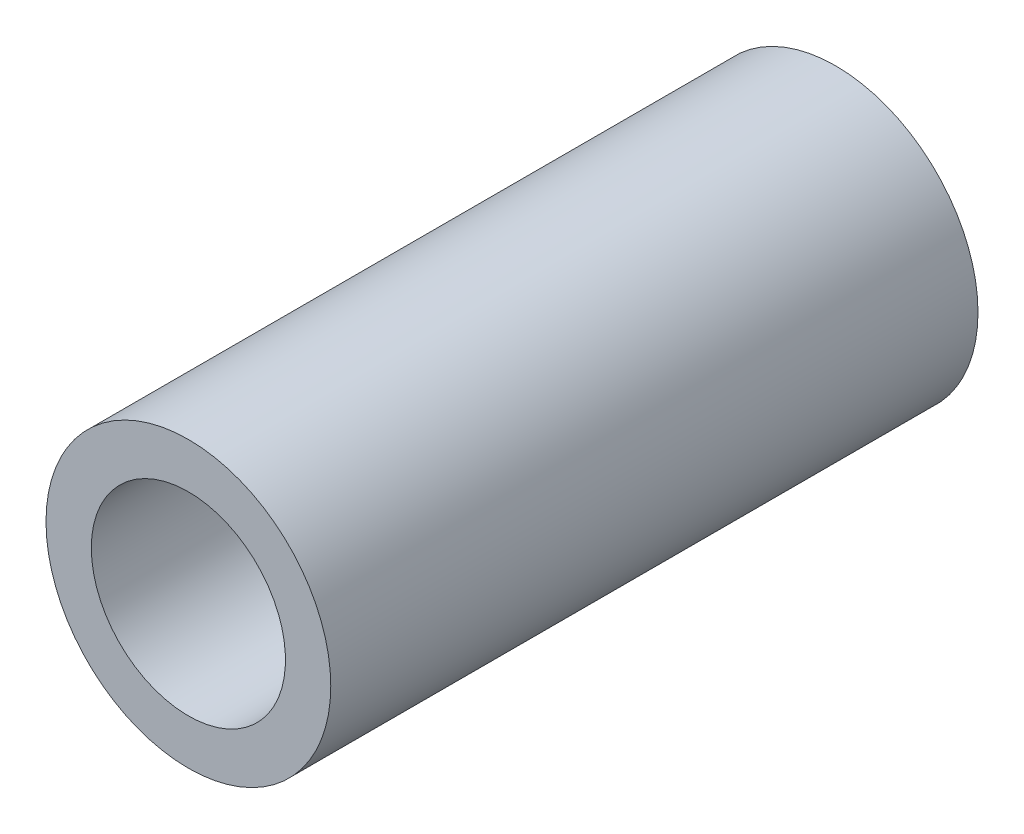
ISO-10303-21;
HEADER;
FILE_DESCRIPTION(('STEP AP214'),'2;1');
FILE_NAME('part.step','',(''),(''),'','','');
FILE_SCHEMA(('AUTOMOTIVE_DESIGN { 1 0 10303 214 1 1 1 1 }'));
ENDSEC;
DATA;
#1=APPLICATION_CONTEXT('core data for automotive mechanical design processes');
#2=APPLICATION_PROTOCOL_DEFINITION('international standard','automotive_design',2000,#1);
#3=PRODUCT_CONTEXT('',#1,'mechanical');
#4=PRODUCT('Part','Part','',(#3));
#5=PRODUCT_RELATED_PRODUCT_CATEGORY('part','',(#4));
#6=PRODUCT_DEFINITION_FORMATION('','',#4);
#7=PRODUCT_DEFINITION_CONTEXT('part definition',#1,'design');
#8=PRODUCT_DEFINITION('design','',#6,#7);
#9=PRODUCT_DEFINITION_SHAPE('','',#8);
#10=(LENGTH_UNIT() NAMED_UNIT(*) SI_UNIT(.MILLI.,.METRE.));
#11=(NAMED_UNIT(*) PLANE_ANGLE_UNIT() SI_UNIT($,.RADIAN.));
#12=(NAMED_UNIT(*) SI_UNIT($,.STERADIAN.) SOLID_ANGLE_UNIT());
#13=UNCERTAINTY_MEASURE_WITH_UNIT(LENGTH_MEASURE(1.E-05),#10,'distance_accuracy_value','');
#14=(GEOMETRIC_REPRESENTATION_CONTEXT(3) GLOBAL_UNCERTAINTY_ASSIGNED_CONTEXT((#13)) GLOBAL_UNIT_ASSIGNED_CONTEXT((#10,
#11,#12)) REPRESENTATION_CONTEXT('',''));
#15=CARTESIAN_POINT('',(0.,0.,0.));
#16=DIRECTION('',(0.,0.,1.));
#17=DIRECTION('',(1.,0.,0.));
#18=AXIS2_PLACEMENT_3D('',#15,#16,#17);
#19=CARTESIAN_POINT('',(0.,0.,100.));
#20=DIRECTION('',(0.,0.,-1.));
#21=DIRECTION('',(-1.,0.,0.));
#22=AXIS2_PLACEMENT_3D('',#19,#20,#21);
#23=CYLINDRICAL_SURFACE('',#22,22.);
#24=CARTESIAN_POINT('',(0.,0.,100.));
#25=DIRECTION('',(0.,0.,1.));
#26=DIRECTION('',(1.,0.,0.));
#27=AXIS2_PLACEMENT_3D('',#24,#25,#26);
#28=CIRCLE('',#27,22.);
#29=CARTESIAN_POINT('',(22.,0.,100.));
#30=VERTEX_POINT('',#29);
#31=EDGE_CURVE('E10',#30,#30,#28,.T.);
#32=ORIENTED_EDGE('',*,*,#31,.F.);
#33=EDGE_LOOP('',(#32));
#34=FACE_BOUND('',#33,.T.);
#35=CARTESIAN_POINT('',(0.,0.,0.));
#36=DIRECTION('',(0.,0.,1.));
#37=DIRECTION('',(1.,0.,0.));
#38=AXIS2_PLACEMENT_3D('',#35,#36,#37);
#39=CIRCLE('',#38,22.);
#40=CARTESIAN_POINT('',(22.,0.,0.));
#41=VERTEX_POINT('',#40);
#42=EDGE_CURVE('E38',#41,#41,#39,.T.);
#43=ORIENTED_EDGE('',*,*,#42,.T.);
#44=EDGE_LOOP('',(#43));
#45=FACE_BOUND('',#44,.T.);
#46=ADVANCED_FACE('F35',(#34,#45),#23,.T.);
#47=CARTESIAN_POINT('',(0.,0.,100.));
#48=DIRECTION('',(0.,0.,1.));
#49=DIRECTION('',(1.,0.,0.));
#50=AXIS2_PLACEMENT_3D('',#47,#48,#49);
#51=PLANE('',#50);
#52=CARTESIAN_POINT('',(0.,0.,100.));
#53=DIRECTION('',(0.,0.,-1.));
#54=DIRECTION('',(-1.,0.,0.));
#55=AXIS2_PLACEMENT_3D('',#52,#53,#54);
#56=CIRCLE('',#55,15.);
#57=CARTESIAN_POINT('',(-15.,0.,100.));
#58=VERTEX_POINT('',#57);
#59=EDGE_CURVE('E45',#58,#58,#56,.T.);
#60=ORIENTED_EDGE('',*,*,#59,.T.);
#61=EDGE_LOOP('',(#60));
#62=FACE_BOUND('',#61,.T.);
#63=ORIENTED_EDGE('',*,*,#31,.T.);
#64=EDGE_LOOP('',(#63));
#65=FACE_BOUND('',#64,.T.);
#66=ADVANCED_FACE('F53',(#62,#65),#51,.T.);
#67=CARTESIAN_POINT('',(0.,0.,0.));
#68=DIRECTION('',(0.,0.,1.));
#69=DIRECTION('',(1.,0.,0.));
#70=AXIS2_PLACEMENT_3D('',#67,#68,#69);
#71=PLANE('',#70);
#72=CARTESIAN_POINT('',(0.,0.,0.));
#73=DIRECTION('',(0.,0.,-1.));
#74=DIRECTION('',(-1.,0.,0.));
#75=AXIS2_PLACEMENT_3D('',#72,#73,#74);
#76=CIRCLE('',#75,15.);
#77=CARTESIAN_POINT('',(-15.,0.,0.));
#78=VERTEX_POINT('',#77);
#79=EDGE_CURVE('E47',#78,#78,#76,.T.);
#80=ORIENTED_EDGE('',*,*,#79,.F.);
#81=EDGE_LOOP('',(#80));
#82=FACE_BOUND('',#81,.T.);
#83=ORIENTED_EDGE('',*,*,#42,.F.);
#84=EDGE_LOOP('',(#83));
#85=FACE_BOUND('',#84,.T.);
#86=ADVANCED_FACE('F58',(#82,#85),#71,.F.);
#87=CARTESIAN_POINT('',(0.,0.,100.));
#88=DIRECTION('',(0.,0.,-1.));
#89=DIRECTION('',(-1.,0.,0.));
#90=AXIS2_PLACEMENT_3D('',#87,#88,#89);
#91=CYLINDRICAL_SURFACE('',#90,15.);
#92=ORIENTED_EDGE('',*,*,#59,.F.);
#93=EDGE_LOOP('',(#92));
#94=FACE_BOUND('',#93,.T.);
#95=ORIENTED_EDGE('',*,*,#79,.T.);
#96=EDGE_LOOP('',(#95));
#97=FACE_BOUND('',#96,.T.);
#98=ADVANCED_FACE('F55',(#94,#97),#91,.F.);
#99=CLOSED_SHELL('',(#46,#66,#86,#98));
#100=MANIFOLD_SOLID_BREP('B2',#99);
#101=ADVANCED_BREP_SHAPE_REPRESENTATION('',(#18,#100),#14);
#102=SHAPE_DEFINITION_REPRESENTATION(#9,#101);
ENDSEC;
END-ISO-10303-21;
